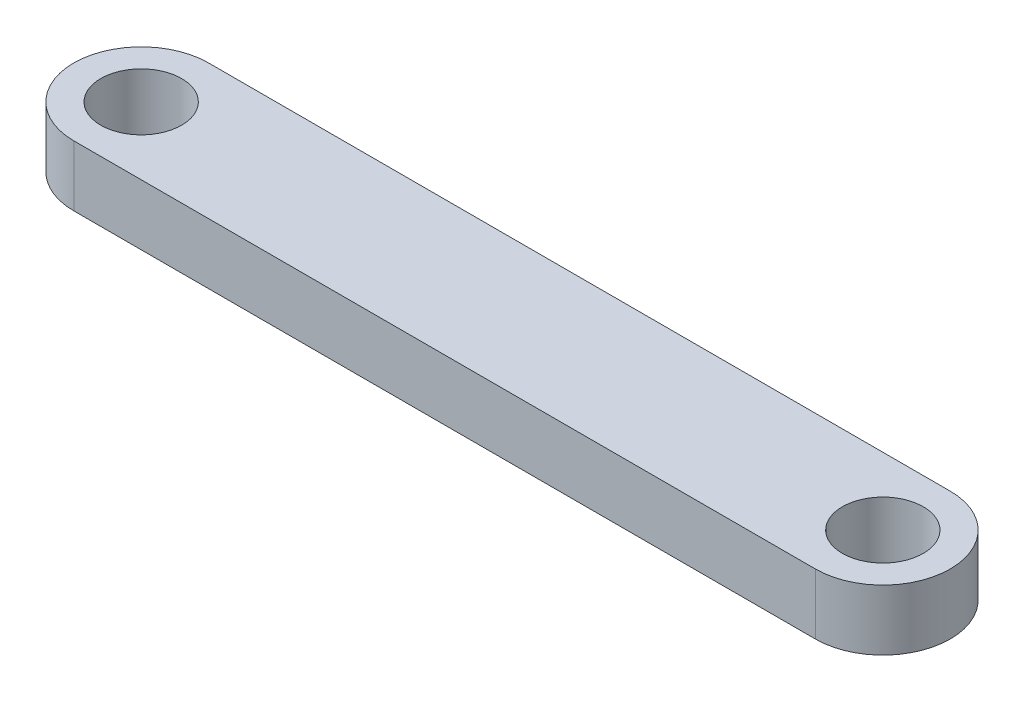
ISO-10303-21;
HEADER;
FILE_DESCRIPTION(('STEP AP214'),'2;1');
FILE_NAME('part.step','',(''),(''),'','','');
FILE_SCHEMA(('AUTOMOTIVE_DESIGN { 1 0 10303 214 1 1 1 1 }'));
ENDSEC;
DATA;
#1=APPLICATION_CONTEXT('core data for automotive mechanical design processes');
#2=APPLICATION_PROTOCOL_DEFINITION('international standard','automotive_design',2000,#1);
#3=PRODUCT_CONTEXT('',#1,'mechanical');
#4=PRODUCT('Part','Part','',(#3));
#5=PRODUCT_RELATED_PRODUCT_CATEGORY('part','',(#4));
#6=PRODUCT_DEFINITION_FORMATION('','',#4);
#7=PRODUCT_DEFINITION_CONTEXT('part definition',#1,'design');
#8=PRODUCT_DEFINITION('design','',#6,#7);
#9=PRODUCT_DEFINITION_SHAPE('','',#8);
#10=(LENGTH_UNIT() NAMED_UNIT(*) SI_UNIT(.MILLI.,.METRE.));
#11=(NAMED_UNIT(*) PLANE_ANGLE_UNIT() SI_UNIT($,.RADIAN.));
#12=(NAMED_UNIT(*) SI_UNIT($,.STERADIAN.) SOLID_ANGLE_UNIT());
#13=UNCERTAINTY_MEASURE_WITH_UNIT(LENGTH_MEASURE(1.E-05),#10,'distance_accuracy_value','');
#14=(GEOMETRIC_REPRESENTATION_CONTEXT(3) GLOBAL_UNCERTAINTY_ASSIGNED_CONTEXT((#13)) GLOBAL_UNIT_ASSIGNED_CONTEXT((#10,
#11,#12)) REPRESENTATION_CONTEXT('',''));
#15=CARTESIAN_POINT('',(0.,0.,0.));
#16=DIRECTION('',(0.,0.,1.));
#17=DIRECTION('',(1.,0.,0.));
#18=AXIS2_PLACEMENT_3D('',#15,#16,#17);
#19=CARTESIAN_POINT('',(25.,4.5,0.));
#20=DIRECTION('',(0.,1.,0.));
#21=DIRECTION('',(0.,0.,1.));
#22=AXIS2_PLACEMENT_3D('',#19,#20,#21);
#23=PLANE('',#22);
#24=CARTESIAN_POINT('',(-30.,4.5,0.));
#25=DIRECTION('',(0.,1.,0.));
#26=DIRECTION('',(0.,0.,1.));
#27=AXIS2_PLACEMENT_3D('',#24,#25,#26);
#28=CIRCLE('',#27,3.);
#29=CARTESIAN_POINT('',(-30.,4.5,3.));
#30=VERTEX_POINT('',#29);
#31=EDGE_CURVE('E107',#30,#30,#28,.T.);
#32=ORIENTED_EDGE('',*,*,#31,.F.);
#33=EDGE_LOOP('',(#32));
#34=FACE_BOUND('',#33,.T.);
#35=CARTESIAN_POINT('',(25.,4.5,0.));
#36=DIRECTION('',(0.,1.,0.));
#37=DIRECTION('',(0.,0.,1.));
#38=AXIS2_PLACEMENT_3D('',#35,#36,#37);
#39=CIRCLE('',#38,5.);
#40=CARTESIAN_POINT('',(25.,4.5,5.));
#41=VERTEX_POINT('',#40);
#42=CARTESIAN_POINT('',(25.,4.5,-5.));
#43=VERTEX_POINT('',#42);
#44=EDGE_CURVE('E91',#41,#43,#39,.T.);
#45=ORIENTED_EDGE('',*,*,#44,.T.);
#46=DIRECTION('',(-1.,0.,0.));
#47=VECTOR('',#46,1.);
#48=CARTESIAN_POINT('',(-30.,4.5,-5.));
#49=LINE('',#48,#47);
#50=CARTESIAN_POINT('',(-30.,4.5,-5.));
#51=VERTEX_POINT('',#50);
#52=EDGE_CURVE('E86',#43,#51,#49,.T.);
#53=ORIENTED_EDGE('',*,*,#52,.T.);
#54=CARTESIAN_POINT('',(-30.,4.5,0.));
#55=DIRECTION('',(0.,1.,0.));
#56=DIRECTION('',(0.,0.,1.));
#57=AXIS2_PLACEMENT_3D('',#54,#55,#56);
#58=CIRCLE('',#57,5.);
#59=CARTESIAN_POINT('',(-30.,4.5,5.));
#60=VERTEX_POINT('',#59);
#61=EDGE_CURVE('E93',#51,#60,#58,.T.);
#62=ORIENTED_EDGE('',*,*,#61,.T.);
#63=DIRECTION('',(1.,0.,0.));
#64=VECTOR('',#63,1.);
#65=CARTESIAN_POINT('',(-30.,4.5,5.));
#66=LINE('',#65,#64);
#67=EDGE_CURVE('E59',#60,#41,#66,.T.);
#68=ORIENTED_EDGE('',*,*,#67,.T.);
#69=EDGE_LOOP('',(#45,#53,#62,#68));
#70=FACE_BOUND('',#69,.T.);
#71=CARTESIAN_POINT('',(25.,4.5,0.));
#72=DIRECTION('',(0.,1.,0.));
#73=DIRECTION('',(0.,0.,1.));
#74=AXIS2_PLACEMENT_3D('',#71,#72,#73);
#75=CIRCLE('',#74,3.);
#76=CARTESIAN_POINT('',(25.,4.5,3.));
#77=VERTEX_POINT('',#76);
#78=EDGE_CURVE('E122',#77,#77,#75,.T.);
#79=ORIENTED_EDGE('',*,*,#78,.F.);
#80=EDGE_LOOP('',(#79));
#81=FACE_BOUND('',#80,.T.);
#82=ADVANCED_FACE('F41',(#34,#70,#81),#23,.T.);
#83=CARTESIAN_POINT('',(25.,0.,0.));
#84=DIRECTION('',(0.,1.,0.));
#85=DIRECTION('',(0.,0.,1.));
#86=AXIS2_PLACEMENT_3D('',#83,#84,#85);
#87=PLANE('',#86);
#88=CARTESIAN_POINT('',(25.,0.,0.));
#89=DIRECTION('',(0.,1.,0.));
#90=DIRECTION('',(0.,0.,1.));
#91=AXIS2_PLACEMENT_3D('',#88,#89,#90);
#92=CIRCLE('',#91,5.);
#93=CARTESIAN_POINT('',(25.,0.,5.));
#94=VERTEX_POINT('',#93);
#95=CARTESIAN_POINT('',(25.,0.,-5.));
#96=VERTEX_POINT('',#95);
#97=EDGE_CURVE('E104',#94,#96,#92,.T.);
#98=ORIENTED_EDGE('',*,*,#97,.F.);
#99=DIRECTION('',(1.,0.,0.));
#100=VECTOR('',#99,1.);
#101=CARTESIAN_POINT('',(-30.,0.,5.));
#102=LINE('',#101,#100);
#103=CARTESIAN_POINT('',(-30.,0.,5.));
#104=VERTEX_POINT('',#103);
#105=EDGE_CURVE('E81',#104,#94,#102,.T.);
#106=ORIENTED_EDGE('',*,*,#105,.F.);
#107=CARTESIAN_POINT('',(-30.,0.,0.));
#108=DIRECTION('',(0.,1.,0.));
#109=DIRECTION('',(0.,0.,1.));
#110=AXIS2_PLACEMENT_3D('',#107,#108,#109);
#111=CIRCLE('',#110,5.);
#112=CARTESIAN_POINT('',(-30.,0.,-5.));
#113=VERTEX_POINT('',#112);
#114=EDGE_CURVE('E73',#113,#104,#111,.T.);
#115=ORIENTED_EDGE('',*,*,#114,.F.);
#116=DIRECTION('',(-1.,0.,0.));
#117=VECTOR('',#116,1.);
#118=CARTESIAN_POINT('',(-30.,0.,-5.));
#119=LINE('',#118,#117);
#120=EDGE_CURVE('E100',#96,#113,#119,.T.);
#121=ORIENTED_EDGE('',*,*,#120,.F.);
#122=EDGE_LOOP('',(#98,#106,#115,#121));
#123=FACE_BOUND('',#122,.T.);
#124=CARTESIAN_POINT('',(-30.,0.,0.));
#125=DIRECTION('',(0.,1.,0.));
#126=DIRECTION('',(0.,0.,1.));
#127=AXIS2_PLACEMENT_3D('',#124,#125,#126);
#128=CIRCLE('',#127,3.);
#129=CARTESIAN_POINT('',(-30.,0.,3.));
#130=VERTEX_POINT('',#129);
#131=EDGE_CURVE('E118',#130,#130,#128,.T.);
#132=ORIENTED_EDGE('',*,*,#131,.T.);
#133=EDGE_LOOP('',(#132));
#134=FACE_BOUND('',#133,.T.);
#135=CARTESIAN_POINT('',(25.,0.,0.));
#136=DIRECTION('',(0.,1.,0.));
#137=DIRECTION('',(0.,0.,1.));
#138=AXIS2_PLACEMENT_3D('',#135,#136,#137);
#139=CIRCLE('',#138,3.);
#140=CARTESIAN_POINT('',(25.,0.,3.));
#141=VERTEX_POINT('',#140);
#142=EDGE_CURVE('E127',#141,#141,#139,.T.);
#143=ORIENTED_EDGE('',*,*,#142,.T.);
#144=EDGE_LOOP('',(#143));
#145=FACE_BOUND('',#144,.T.);
#146=ADVANCED_FACE('F117',(#123,#134,#145),#87,.F.);
#147=CARTESIAN_POINT('',(25.,4.5,0.));
#148=DIRECTION('',(0.,-1.,0.));
#149=DIRECTION('',(0.,0.,-1.));
#150=AXIS2_PLACEMENT_3D('',#147,#148,#149);
#151=CYLINDRICAL_SURFACE('',#150,5.);
#152=ORIENTED_EDGE('',*,*,#97,.T.);
#153=DIRECTION('',(0.,-1.,0.));
#154=VECTOR('',#153,1.);
#155=CARTESIAN_POINT('',(25.,4.5,-5.));
#156=LINE('',#155,#154);
#157=EDGE_CURVE('E11',#43,#96,#156,.T.);
#158=ORIENTED_EDGE('',*,*,#157,.F.);
#159=ORIENTED_EDGE('',*,*,#44,.F.);
#160=DIRECTION('',(0.,-1.,0.));
#161=VECTOR('',#160,1.);
#162=CARTESIAN_POINT('',(25.,4.5,5.));
#163=LINE('',#162,#161);
#164=EDGE_CURVE('E101',#41,#94,#163,.T.);
#165=ORIENTED_EDGE('',*,*,#164,.T.);
#166=EDGE_LOOP('',(#152,#158,#159,#165));
#167=FACE_BOUND('',#166,.T.);
#168=ADVANCED_FACE('F43',(#167),#151,.T.);
#169=CARTESIAN_POINT('',(-30.,4.5,-5.));
#170=DIRECTION('',(0.,0.,1.));
#171=DIRECTION('',(1.,0.,0.));
#172=AXIS2_PLACEMENT_3D('',#169,#170,#171);
#173=PLANE('',#172);
#174=ORIENTED_EDGE('',*,*,#120,.T.);
#175=DIRECTION('',(0.,-1.,0.));
#176=VECTOR('',#175,1.);
#177=CARTESIAN_POINT('',(-30.,4.5,-5.));
#178=LINE('',#177,#176);
#179=EDGE_CURVE('E49',#51,#113,#178,.T.);
#180=ORIENTED_EDGE('',*,*,#179,.F.);
#181=ORIENTED_EDGE('',*,*,#52,.F.);
#182=ORIENTED_EDGE('',*,*,#157,.T.);
#183=EDGE_LOOP('',(#174,#180,#181,#182));
#184=FACE_BOUND('',#183,.T.);
#185=ADVANCED_FACE('F96',(#184),#173,.F.);
#186=CARTESIAN_POINT('',(-30.,4.5,0.));
#187=DIRECTION('',(0.,-1.,0.));
#188=DIRECTION('',(0.,0.,-1.));
#189=AXIS2_PLACEMENT_3D('',#186,#187,#188);
#190=CYLINDRICAL_SURFACE('',#189,5.);
#191=ORIENTED_EDGE('',*,*,#114,.T.);
#192=DIRECTION('',(0.,-1.,0.));
#193=VECTOR('',#192,1.);
#194=CARTESIAN_POINT('',(-30.,4.5,5.));
#195=LINE('',#194,#193);
#196=EDGE_CURVE('E98',#60,#104,#195,.T.);
#197=ORIENTED_EDGE('',*,*,#196,.F.);
#198=ORIENTED_EDGE('',*,*,#61,.F.);
#199=ORIENTED_EDGE('',*,*,#179,.T.);
#200=EDGE_LOOP('',(#191,#197,#198,#199));
#201=FACE_BOUND('',#200,.T.);
#202=ADVANCED_FACE('F97',(#201),#190,.T.);
#203=CARTESIAN_POINT('',(-30.,4.5,5.));
#204=DIRECTION('',(0.,0.,-1.));
#205=DIRECTION('',(-1.,0.,0.));
#206=AXIS2_PLACEMENT_3D('',#203,#204,#205);
#207=PLANE('',#206);
#208=ORIENTED_EDGE('',*,*,#105,.T.);
#209=ORIENTED_EDGE('',*,*,#164,.F.);
#210=ORIENTED_EDGE('',*,*,#67,.F.);
#211=ORIENTED_EDGE('',*,*,#196,.T.);
#212=EDGE_LOOP('',(#208,#209,#210,#211));
#213=FACE_BOUND('',#212,.T.);
#214=ADVANCED_FACE('F114',(#213),#207,.F.);
#215=CARTESIAN_POINT('',(-30.,4.5,0.));
#216=DIRECTION('',(0.,-1.,0.));
#217=DIRECTION('',(0.,0.,-1.));
#218=AXIS2_PLACEMENT_3D('',#215,#216,#217);
#219=CYLINDRICAL_SURFACE('',#218,3.);
#220=ORIENTED_EDGE('',*,*,#31,.T.);
#221=EDGE_LOOP('',(#220));
#222=FACE_BOUND('',#221,.T.);
#223=ORIENTED_EDGE('',*,*,#131,.F.);
#224=EDGE_LOOP('',(#223));
#225=FACE_BOUND('',#224,.T.);
#226=ADVANCED_FACE('F141',(#222,#225),#219,.F.);
#227=CARTESIAN_POINT('',(25.,4.5,0.));
#228=DIRECTION('',(0.,-1.,0.));
#229=DIRECTION('',(0.,0.,-1.));
#230=AXIS2_PLACEMENT_3D('',#227,#228,#229);
#231=CYLINDRICAL_SURFACE('',#230,3.);
#232=ORIENTED_EDGE('',*,*,#78,.T.);
#233=EDGE_LOOP('',(#232));
#234=FACE_BOUND('',#233,.T.);
#235=ORIENTED_EDGE('',*,*,#142,.F.);
#236=EDGE_LOOP('',(#235));
#237=FACE_BOUND('',#236,.T.);
#238=ADVANCED_FACE('F135',(#234,#237),#231,.F.);
#239=CLOSED_SHELL('',(#82,#146,#168,#185,#202,#214,#226,#238));
#240=MANIFOLD_SOLID_BREP('B2',#239);
#241=ADVANCED_BREP_SHAPE_REPRESENTATION('',(#18,#240),#14);
#242=SHAPE_DEFINITION_REPRESENTATION(#9,#241);
ENDSEC;
END-ISO-10303-21;
